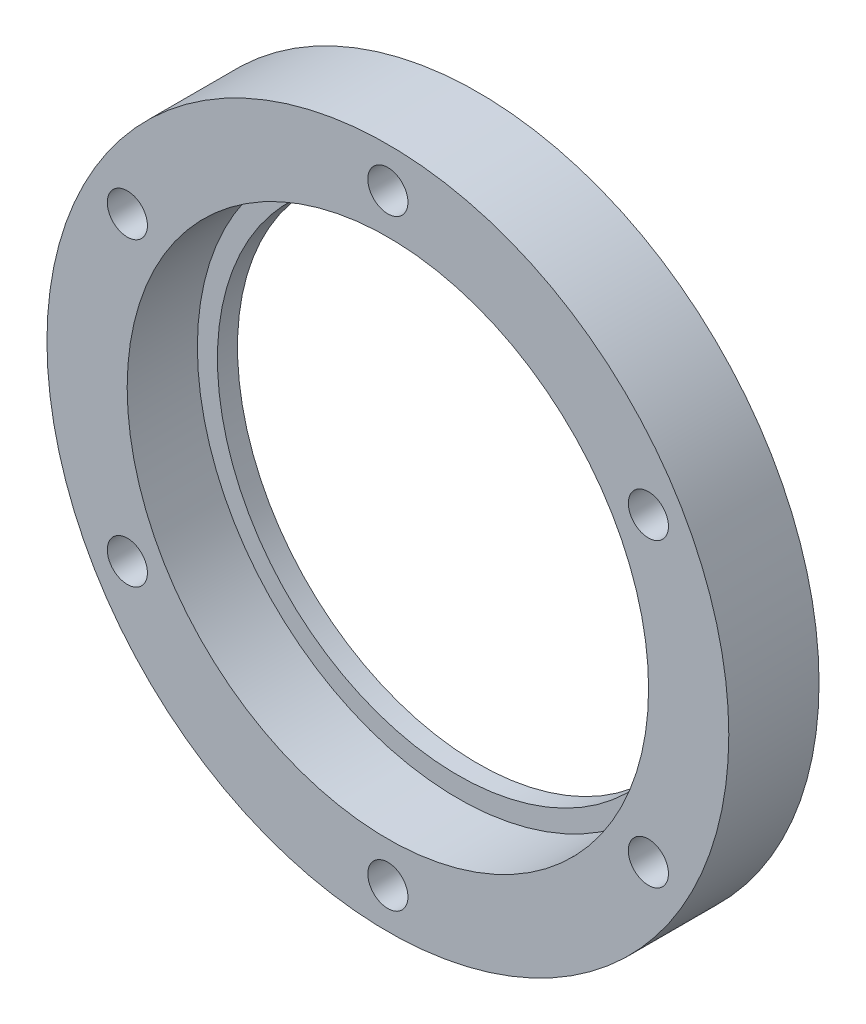
ISO-10303-21;
HEADER;
FILE_DESCRIPTION(('STEP AP214'),'2;1');
FILE_NAME('part.step','',(''),(''),'','','');
FILE_SCHEMA(('AUTOMOTIVE_DESIGN { 1 0 10303 214 1 1 1 1 }'));
ENDSEC;
DATA;
#1=APPLICATION_CONTEXT('core data for automotive mechanical design processes');
#2=APPLICATION_PROTOCOL_DEFINITION('international standard','automotive_design',2000,#1);
#3=PRODUCT_CONTEXT('',#1,'mechanical');
#4=PRODUCT('Part','Part','',(#3));
#5=PRODUCT_RELATED_PRODUCT_CATEGORY('part','',(#4));
#6=PRODUCT_DEFINITION_FORMATION('','',#4);
#7=PRODUCT_DEFINITION_CONTEXT('part definition',#1,'design');
#8=PRODUCT_DEFINITION('design','',#6,#7);
#9=PRODUCT_DEFINITION_SHAPE('','',#8);
#10=(LENGTH_UNIT() NAMED_UNIT(*) SI_UNIT(.MILLI.,.METRE.));
#11=(NAMED_UNIT(*) PLANE_ANGLE_UNIT() SI_UNIT($,.RADIAN.));
#12=(NAMED_UNIT(*) SI_UNIT($,.STERADIAN.) SOLID_ANGLE_UNIT());
#13=UNCERTAINTY_MEASURE_WITH_UNIT(LENGTH_MEASURE(1.E-05),#10,'distance_accuracy_value','');
#14=(GEOMETRIC_REPRESENTATION_CONTEXT(3) GLOBAL_UNCERTAINTY_ASSIGNED_CONTEXT((#13)) GLOBAL_UNIT_ASSIGNED_CONTEXT((#10,
#11,#12)) REPRESENTATION_CONTEXT('',''));
#15=CARTESIAN_POINT('',(0.,0.,0.));
#16=DIRECTION('',(0.,0.,1.));
#17=DIRECTION('',(1.,0.,0.));
#18=AXIS2_PLACEMENT_3D('',#15,#16,#17);
#19=CARTESIAN_POINT('',(0.,0.,9.));
#20=DIRECTION('',(0.,0.,-1.));
#21=DIRECTION('',(-1.,0.,0.));
#22=AXIS2_PLACEMENT_3D('',#19,#20,#21);
#23=CYLINDRICAL_SURFACE('',#22,34.);
#24=CARTESIAN_POINT('',(0.,0.,9.));
#25=DIRECTION('',(0.,0.,1.));
#26=DIRECTION('',(1.,0.,0.));
#27=AXIS2_PLACEMENT_3D('',#24,#25,#26);
#28=CIRCLE('',#27,34.);
#29=CARTESIAN_POINT('',(34.,0.,9.));
#30=VERTEX_POINT('',#29);
#31=EDGE_CURVE('E10',#30,#30,#28,.T.);
#32=ORIENTED_EDGE('',*,*,#31,.F.);
#33=EDGE_LOOP('',(#32));
#34=FACE_BOUND('',#33,.T.);
#35=CARTESIAN_POINT('',(0.,0.,0.));
#36=DIRECTION('',(0.,0.,1.));
#37=DIRECTION('',(1.,0.,0.));
#38=AXIS2_PLACEMENT_3D('',#35,#36,#37);
#39=CIRCLE('',#38,34.);
#40=CARTESIAN_POINT('',(34.,0.,0.));
#41=VERTEX_POINT('',#40);
#42=EDGE_CURVE('E37',#41,#41,#39,.T.);
#43=ORIENTED_EDGE('',*,*,#42,.T.);
#44=EDGE_LOOP('',(#43));
#45=FACE_BOUND('',#44,.T.);
#46=ADVANCED_FACE('F34',(#34,#45),#23,.T.);
#47=CARTESIAN_POINT('',(0.,0.,9.));
#48=DIRECTION('',(0.,0.,1.));
#49=DIRECTION('',(1.,0.,0.));
#50=AXIS2_PLACEMENT_3D('',#47,#48,#49);
#51=PLANE('',#50);
#52=CARTESIAN_POINT('',(25.9807621135339,15.0000000000013,9.));
#53=DIRECTION('',(0.,0.,1.));
#54=DIRECTION('',(1.,0.,0.));
#55=AXIS2_PLACEMENT_3D('',#52,#53,#54);
#56=CIRCLE('',#55,2.);
#57=CARTESIAN_POINT('',(27.9807621135339,15.0000000000013,9.));
#58=VERTEX_POINT('',#57);
#59=EDGE_CURVE('E88',#58,#58,#56,.T.);
#60=ORIENTED_EDGE('',*,*,#59,.F.);
#61=EDGE_LOOP('',(#60));
#62=FACE_BOUND('',#61,.T.);
#63=CARTESIAN_POINT('',(25.9807621135354,-14.9999999999987,9.));
#64=DIRECTION('',(0.,0.,1.));
#65=DIRECTION('',(1.,0.,0.));
#66=AXIS2_PLACEMENT_3D('',#63,#64,#65);
#67=CIRCLE('',#66,2.);
#68=CARTESIAN_POINT('',(27.9807621135354,-14.9999999999987,9.));
#69=VERTEX_POINT('',#68);
#70=EDGE_CURVE('E82',#69,#69,#67,.T.);
#71=ORIENTED_EDGE('',*,*,#70,.F.);
#72=EDGE_LOOP('',(#71));
#73=FACE_BOUND('',#72,.T.);
#74=CARTESIAN_POINT('',(2.97509463919882E-12,-30.,9.));
#75=DIRECTION('',(0.,0.,1.));
#76=DIRECTION('',(1.,0.,0.));
#77=AXIS2_PLACEMENT_3D('',#74,#75,#76);
#78=CIRCLE('',#77,2.);
#79=CARTESIAN_POINT('',(2.00000000000298,-30.,9.));
#80=VERTEX_POINT('',#79);
#81=EDGE_CURVE('E76',#80,#80,#78,.T.);
#82=ORIENTED_EDGE('',*,*,#81,.F.);
#83=EDGE_LOOP('',(#82));
#84=FACE_BOUND('',#83,.T.);
#85=CARTESIAN_POINT('',(-25.9807621135309,-15.0000000000013,9.));
#86=DIRECTION('',(0.,0.,1.));
#87=DIRECTION('',(1.,0.,0.));
#88=AXIS2_PLACEMENT_3D('',#85,#86,#87);
#89=CIRCLE('',#88,2.);
#90=CARTESIAN_POINT('',(-23.9807621135309,-15.0000000000013,9.));
#91=VERTEX_POINT('',#90);
#92=EDGE_CURVE('E70',#91,#91,#89,.T.);
#93=ORIENTED_EDGE('',*,*,#92,.F.);
#94=EDGE_LOOP('',(#93));
#95=FACE_BOUND('',#94,.T.);
#96=CARTESIAN_POINT('',(-25.9807621135324,14.9999999999987,9.));
#97=DIRECTION('',(0.,0.,1.));
#98=DIRECTION('',(1.,0.,0.));
#99=AXIS2_PLACEMENT_3D('',#96,#97,#98);
#100=CIRCLE('',#99,2.);
#101=CARTESIAN_POINT('',(-23.9807621135324,14.9999999999987,9.));
#102=VERTEX_POINT('',#101);
#103=EDGE_CURVE('E64',#102,#102,#100,.T.);
#104=ORIENTED_EDGE('',*,*,#103,.F.);
#105=EDGE_LOOP('',(#104));
#106=FACE_BOUND('',#105,.T.);
#107=CARTESIAN_POINT('',(0.,30.,9.));
#108=DIRECTION('',(0.,0.,1.));
#109=DIRECTION('',(1.,0.,0.));
#110=AXIS2_PLACEMENT_3D('',#107,#108,#109);
#111=CIRCLE('',#110,2.);
#112=CARTESIAN_POINT('',(2.,30.,9.));
#113=VERTEX_POINT('',#112);
#114=EDGE_CURVE('E58',#113,#113,#111,.T.);
#115=ORIENTED_EDGE('',*,*,#114,.F.);
#116=EDGE_LOOP('',(#115));
#117=FACE_BOUND('',#116,.T.);
#118=CARTESIAN_POINT('',(0.,0.,9.));
#119=DIRECTION('',(0.,0.,1.));
#120=DIRECTION('',(1.,0.,0.));
#121=AXIS2_PLACEMENT_3D('',#118,#119,#120);
#122=CIRCLE('',#121,26.);
#123=CARTESIAN_POINT('',(26.,0.,9.));
#124=VERTEX_POINT('',#123);
#125=EDGE_CURVE('E46',#124,#124,#122,.T.);
#126=ORIENTED_EDGE('',*,*,#125,.F.);
#127=EDGE_LOOP('',(#126));
#128=FACE_BOUND('',#127,.T.);
#129=ORIENTED_EDGE('',*,*,#31,.T.);
#130=EDGE_LOOP('',(#129));
#131=FACE_BOUND('',#130,.T.);
#132=ADVANCED_FACE('F104',(#62,#73,#84,#95,#106,#117,#128,#131),#51,.T.);
#133=CARTESIAN_POINT('',(0.,0.,0.));
#134=DIRECTION('',(0.,0.,1.));
#135=DIRECTION('',(1.,0.,0.));
#136=AXIS2_PLACEMENT_3D('',#133,#134,#135);
#137=PLANE('',#136);
#138=CARTESIAN_POINT('',(25.9807621135339,15.0000000000013,0.));
#139=DIRECTION('',(0.,0.,1.));
#140=DIRECTION('',(1.,0.,0.));
#141=AXIS2_PLACEMENT_3D('',#138,#139,#140);
#142=CIRCLE('',#141,2.);
#143=CARTESIAN_POINT('',(27.9807621135339,15.0000000000013,0.));
#144=VERTEX_POINT('',#143);
#145=EDGE_CURVE('E61',#144,#144,#142,.T.);
#146=ORIENTED_EDGE('',*,*,#145,.T.);
#147=EDGE_LOOP('',(#146));
#148=FACE_BOUND('',#147,.T.);
#149=CARTESIAN_POINT('',(25.9807621135354,-14.9999999999987,0.));
#150=DIRECTION('',(0.,0.,1.));
#151=DIRECTION('',(1.,0.,0.));
#152=AXIS2_PLACEMENT_3D('',#149,#150,#151);
#153=CIRCLE('',#152,2.);
#154=CARTESIAN_POINT('',(27.9807621135354,-14.9999999999987,0.));
#155=VERTEX_POINT('',#154);
#156=EDGE_CURVE('E85',#155,#155,#153,.T.);
#157=ORIENTED_EDGE('',*,*,#156,.T.);
#158=EDGE_LOOP('',(#157));
#159=FACE_BOUND('',#158,.T.);
#160=CARTESIAN_POINT('',(2.97509463919882E-12,-30.,0.));
#161=DIRECTION('',(0.,0.,1.));
#162=DIRECTION('',(1.,0.,0.));
#163=AXIS2_PLACEMENT_3D('',#160,#161,#162);
#164=CIRCLE('',#163,2.);
#165=CARTESIAN_POINT('',(2.00000000000298,-30.,0.));
#166=VERTEX_POINT('',#165);
#167=EDGE_CURVE('E79',#166,#166,#164,.T.);
#168=ORIENTED_EDGE('',*,*,#167,.T.);
#169=EDGE_LOOP('',(#168));
#170=FACE_BOUND('',#169,.T.);
#171=CARTESIAN_POINT('',(-25.9807621135309,-15.0000000000013,0.));
#172=DIRECTION('',(0.,0.,1.));
#173=DIRECTION('',(1.,0.,0.));
#174=AXIS2_PLACEMENT_3D('',#171,#172,#173);
#175=CIRCLE('',#174,2.);
#176=CARTESIAN_POINT('',(-23.9807621135309,-15.0000000000013,0.));
#177=VERTEX_POINT('',#176);
#178=EDGE_CURVE('E73',#177,#177,#175,.T.);
#179=ORIENTED_EDGE('',*,*,#178,.T.);
#180=EDGE_LOOP('',(#179));
#181=FACE_BOUND('',#180,.T.);
#182=CARTESIAN_POINT('',(-25.9807621135324,14.9999999999987,0.));
#183=DIRECTION('',(0.,0.,1.));
#184=DIRECTION('',(1.,0.,0.));
#185=AXIS2_PLACEMENT_3D('',#182,#183,#184);
#186=CIRCLE('',#185,2.);
#187=CARTESIAN_POINT('',(-23.9807621135324,14.9999999999987,0.));
#188=VERTEX_POINT('',#187);
#189=EDGE_CURVE('E67',#188,#188,#186,.T.);
#190=ORIENTED_EDGE('',*,*,#189,.T.);
#191=EDGE_LOOP('',(#190));
#192=FACE_BOUND('',#191,.T.);
#193=CARTESIAN_POINT('',(0.,30.,0.));
#194=DIRECTION('',(0.,0.,1.));
#195=DIRECTION('',(1.,0.,0.));
#196=AXIS2_PLACEMENT_3D('',#193,#194,#195);
#197=CIRCLE('',#196,2.);
#198=CARTESIAN_POINT('',(2.,30.,0.));
#199=VERTEX_POINT('',#198);
#200=EDGE_CURVE('E57',#199,#199,#197,.T.);
#201=ORIENTED_EDGE('',*,*,#200,.T.);
#202=EDGE_LOOP('',(#201));
#203=FACE_BOUND('',#202,.T.);
#204=CARTESIAN_POINT('',(0.,0.,0.));
#205=DIRECTION('',(0.,0.,1.));
#206=DIRECTION('',(1.,0.,0.));
#207=AXIS2_PLACEMENT_3D('',#204,#205,#206);
#208=CIRCLE('',#207,24.);
#209=CARTESIAN_POINT('',(24.,0.,0.));
#210=VERTEX_POINT('',#209);
#211=EDGE_CURVE('E49',#210,#210,#208,.T.);
#212=ORIENTED_EDGE('',*,*,#211,.T.);
#213=EDGE_LOOP('',(#212));
#214=FACE_BOUND('',#213,.T.);
#215=ORIENTED_EDGE('',*,*,#42,.F.);
#216=EDGE_LOOP('',(#215));
#217=FACE_BOUND('',#216,.T.);
#218=ADVANCED_FACE('F94',(#148,#159,#170,#181,#192,#203,#214,#217),#137,.F.);
#219=CARTESIAN_POINT('',(0.,0.,2.));
#220=DIRECTION('',(0.,0.,1.));
#221=DIRECTION('',(1.,0.,0.));
#222=AXIS2_PLACEMENT_3D('',#219,#220,#221);
#223=CYLINDRICAL_SURFACE('',#222,26.);
#224=CARTESIAN_POINT('',(0.,0.,2.));
#225=DIRECTION('',(0.,0.,1.));
#226=DIRECTION('',(1.,0.,0.));
#227=AXIS2_PLACEMENT_3D('',#224,#225,#226);
#228=CIRCLE('',#227,26.);
#229=CARTESIAN_POINT('',(26.,0.,2.));
#230=VERTEX_POINT('',#229);
#231=EDGE_CURVE('E44',#230,#230,#228,.T.);
#232=ORIENTED_EDGE('',*,*,#231,.F.);
#233=EDGE_LOOP('',(#232));
#234=FACE_BOUND('',#233,.T.);
#235=ORIENTED_EDGE('',*,*,#125,.T.);
#236=EDGE_LOOP('',(#235));
#237=FACE_BOUND('',#236,.T.);
#238=ADVANCED_FACE('F120',(#234,#237),#223,.F.);
#239=CARTESIAN_POINT('',(0.,0.,2.));
#240=DIRECTION('',(0.,0.,1.));
#241=DIRECTION('',(1.,0.,0.));
#242=AXIS2_PLACEMENT_3D('',#239,#240,#241);
#243=PLANE('',#242);
#244=CARTESIAN_POINT('',(0.,0.,2.));
#245=DIRECTION('',(0.,0.,1.));
#246=DIRECTION('',(1.,0.,0.));
#247=AXIS2_PLACEMENT_3D('',#244,#245,#246);
#248=CIRCLE('',#247,24.);
#249=CARTESIAN_POINT('',(24.,0.,2.));
#250=VERTEX_POINT('',#249);
#251=EDGE_CURVE('E54',#250,#250,#248,.T.);
#252=ORIENTED_EDGE('',*,*,#251,.F.);
#253=EDGE_LOOP('',(#252));
#254=FACE_BOUND('',#253,.T.);
#255=ORIENTED_EDGE('',*,*,#231,.T.);
#256=EDGE_LOOP('',(#255));
#257=FACE_BOUND('',#256,.T.);
#258=ADVANCED_FACE('F122',(#254,#257),#243,.T.);
#259=CARTESIAN_POINT('',(0.,0.,-6.));
#260=DIRECTION('',(0.,0.,1.));
#261=DIRECTION('',(1.,0.,0.));
#262=AXIS2_PLACEMENT_3D('',#259,#260,#261);
#263=CYLINDRICAL_SURFACE('',#262,24.);
#264=ORIENTED_EDGE('',*,*,#251,.T.);
#265=EDGE_LOOP('',(#264));
#266=FACE_BOUND('',#265,.T.);
#267=ORIENTED_EDGE('',*,*,#211,.F.);
#268=EDGE_LOOP('',(#267));
#269=FACE_BOUND('',#268,.T.);
#270=ADVANCED_FACE('F129',(#266,#269),#263,.F.);
#271=CARTESIAN_POINT('',(0.,30.,0.));
#272=DIRECTION('',(0.,0.,1.));
#273=DIRECTION('',(1.,0.,0.));
#274=AXIS2_PLACEMENT_3D('',#271,#272,#273);
#275=CYLINDRICAL_SURFACE('',#274,2.);
#276=ORIENTED_EDGE('',*,*,#200,.F.);
#277=EDGE_LOOP('',(#276));
#278=FACE_BOUND('',#277,.T.);
#279=ORIENTED_EDGE('',*,*,#114,.T.);
#280=EDGE_LOOP('',(#279));
#281=FACE_BOUND('',#280,.T.);
#282=ADVANCED_FACE('F155',(#278,#281),#275,.F.);
#283=CARTESIAN_POINT('',(-25.9807621135324,14.9999999999987,0.));
#284=DIRECTION('',(0.,0.,1.));
#285=DIRECTION('',(1.,0.,0.));
#286=AXIS2_PLACEMENT_3D('',#283,#284,#285);
#287=CYLINDRICAL_SURFACE('',#286,2.);
#288=ORIENTED_EDGE('',*,*,#189,.F.);
#289=EDGE_LOOP('',(#288));
#290=FACE_BOUND('',#289,.T.);
#291=ORIENTED_EDGE('',*,*,#103,.T.);
#292=EDGE_LOOP('',(#291));
#293=FACE_BOUND('',#292,.T.);
#294=ADVANCED_FACE('F160',(#290,#293),#287,.F.);
#295=CARTESIAN_POINT('',(-25.9807621135309,-15.0000000000013,0.));
#296=DIRECTION('',(0.,0.,1.));
#297=DIRECTION('',(1.,0.,0.));
#298=AXIS2_PLACEMENT_3D('',#295,#296,#297);
#299=CYLINDRICAL_SURFACE('',#298,2.);
#300=ORIENTED_EDGE('',*,*,#178,.F.);
#301=EDGE_LOOP('',(#300));
#302=FACE_BOUND('',#301,.T.);
#303=ORIENTED_EDGE('',*,*,#92,.T.);
#304=EDGE_LOOP('',(#303));
#305=FACE_BOUND('',#304,.T.);
#306=ADVANCED_FACE('F172',(#302,#305),#299,.F.);
#307=CARTESIAN_POINT('',(2.97509463919882E-12,-30.,0.));
#308=DIRECTION('',(0.,0.,1.));
#309=DIRECTION('',(1.,0.,0.));
#310=AXIS2_PLACEMENT_3D('',#307,#308,#309);
#311=CYLINDRICAL_SURFACE('',#310,2.);
#312=ORIENTED_EDGE('',*,*,#167,.F.);
#313=EDGE_LOOP('',(#312));
#314=FACE_BOUND('',#313,.T.);
#315=ORIENTED_EDGE('',*,*,#81,.T.);
#316=EDGE_LOOP('',(#315));
#317=FACE_BOUND('',#316,.T.);
#318=ADVANCED_FACE('F182',(#314,#317),#311,.F.);
#319=CARTESIAN_POINT('',(25.9807621135354,-14.9999999999987,0.));
#320=DIRECTION('',(0.,0.,1.));
#321=DIRECTION('',(1.,0.,0.));
#322=AXIS2_PLACEMENT_3D('',#319,#320,#321);
#323=CYLINDRICAL_SURFACE('',#322,2.);
#324=ORIENTED_EDGE('',*,*,#156,.F.);
#325=EDGE_LOOP('',(#324));
#326=FACE_BOUND('',#325,.T.);
#327=ORIENTED_EDGE('',*,*,#70,.T.);
#328=EDGE_LOOP('',(#327));
#329=FACE_BOUND('',#328,.T.);
#330=ADVANCED_FACE('F100',(#326,#329),#323,.F.);
#331=CARTESIAN_POINT('',(25.9807621135339,15.0000000000013,0.));
#332=DIRECTION('',(0.,0.,1.));
#333=DIRECTION('',(1.,0.,0.));
#334=AXIS2_PLACEMENT_3D('',#331,#332,#333);
#335=CYLINDRICAL_SURFACE('',#334,2.);
#336=ORIENTED_EDGE('',*,*,#145,.F.);
#337=EDGE_LOOP('',(#336));
#338=FACE_BOUND('',#337,.T.);
#339=ORIENTED_EDGE('',*,*,#59,.T.);
#340=EDGE_LOOP('',(#339));
#341=FACE_BOUND('',#340,.T.);
#342=ADVANCED_FACE('F97',(#338,#341),#335,.F.);
#343=CLOSED_SHELL('',(#46,#132,#218,#238,#258,#270,#282,#294,#306,#318,#330,#342));
#344=MANIFOLD_SOLID_BREP('B2',#343);
#345=ADVANCED_BREP_SHAPE_REPRESENTATION('',(#18,#344),#14);
#346=SHAPE_DEFINITION_REPRESENTATION(#9,#345);
ENDSEC;
END-ISO-10303-21;
